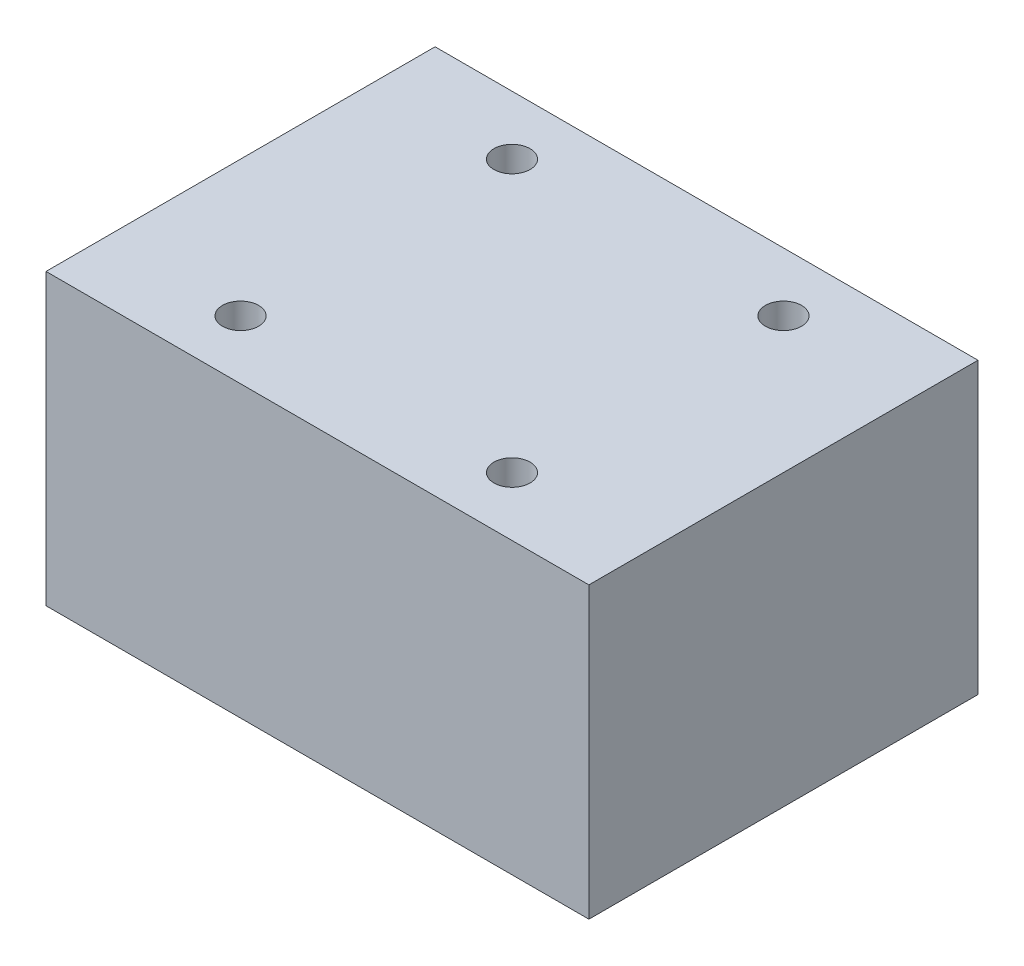
ISO-10303-21;
HEADER;
FILE_DESCRIPTION(('STEP AP214'),'2;1');
FILE_NAME('part.step','',(''),(''),'','','');
FILE_SCHEMA(('AUTOMOTIVE_DESIGN { 1 0 10303 214 1 1 1 1 }'));
ENDSEC;
DATA;
#1=APPLICATION_CONTEXT('core data for automotive mechanical design processes');
#2=APPLICATION_PROTOCOL_DEFINITION('international standard','automotive_design',2000,#1);
#3=PRODUCT_CONTEXT('',#1,'mechanical');
#4=PRODUCT('Part','Part','',(#3));
#5=PRODUCT_RELATED_PRODUCT_CATEGORY('part','',(#4));
#6=PRODUCT_DEFINITION_FORMATION('','',#4);
#7=PRODUCT_DEFINITION_CONTEXT('part definition',#1,'design');
#8=PRODUCT_DEFINITION('design','',#6,#7);
#9=PRODUCT_DEFINITION_SHAPE('','',#8);
#10=(LENGTH_UNIT() NAMED_UNIT(*) SI_UNIT(.MILLI.,.METRE.));
#11=(NAMED_UNIT(*) PLANE_ANGLE_UNIT() SI_UNIT($,.RADIAN.));
#12=(NAMED_UNIT(*) SI_UNIT($,.STERADIAN.) SOLID_ANGLE_UNIT());
#13=UNCERTAINTY_MEASURE_WITH_UNIT(LENGTH_MEASURE(1.E-05),#10,'distance_accuracy_value','');
#14=(GEOMETRIC_REPRESENTATION_CONTEXT(3) GLOBAL_UNCERTAINTY_ASSIGNED_CONTEXT((#13)) GLOBAL_UNIT_ASSIGNED_CONTEXT((#10,
#11,#12)) REPRESENTATION_CONTEXT('',''));
#15=CARTESIAN_POINT('',(0.,0.,0.));
#16=DIRECTION('',(0.,0.,1.));
#17=DIRECTION('',(1.,0.,0.));
#18=AXIS2_PLACEMENT_3D('',#15,#16,#17);
#19=CARTESIAN_POINT('',(30.,32.,-21.5));
#20=DIRECTION('',(-1.,0.,0.));
#21=DIRECTION('',(0.,0.,1.));
#22=AXIS2_PLACEMENT_3D('',#19,#20,#21);
#23=PLANE('',#22);
#24=DIRECTION('',(0.,0.,-1.));
#25=VECTOR('',#24,1.);
#26=CARTESIAN_POINT('',(30.,0.,-21.5));
#27=LINE('',#26,#25);
#28=CARTESIAN_POINT('',(30.,0.,21.5));
#29=VERTEX_POINT('',#28);
#30=CARTESIAN_POINT('',(30.,0.,-21.5));
#31=VERTEX_POINT('',#30);
#32=EDGE_CURVE('E107',#29,#31,#27,.T.);
#33=ORIENTED_EDGE('',*,*,#32,.T.);
#34=DIRECTION('',(0.,-1.,0.));
#35=VECTOR('',#34,1.);
#36=CARTESIAN_POINT('',(30.,32.,-21.5));
#37=LINE('',#36,#35);
#38=CARTESIAN_POINT('',(30.,32.,-21.5));
#39=VERTEX_POINT('',#38);
#40=EDGE_CURVE('E11',#39,#31,#37,.T.);
#41=ORIENTED_EDGE('',*,*,#40,.F.);
#42=DIRECTION('',(0.,0.,-1.));
#43=VECTOR('',#42,1.);
#44=CARTESIAN_POINT('',(30.,32.,-21.5));
#45=LINE('',#44,#43);
#46=CARTESIAN_POINT('',(30.,32.,21.5));
#47=VERTEX_POINT('',#46);
#48=EDGE_CURVE('E91',#47,#39,#45,.T.);
#49=ORIENTED_EDGE('',*,*,#48,.F.);
#50=DIRECTION('',(0.,-1.,0.));
#51=VECTOR('',#50,1.);
#52=CARTESIAN_POINT('',(30.,32.,21.5));
#53=LINE('',#52,#51);
#54=EDGE_CURVE('E103',#47,#29,#53,.T.);
#55=ORIENTED_EDGE('',*,*,#54,.T.);
#56=EDGE_LOOP('',(#33,#41,#49,#55));
#57=FACE_BOUND('',#56,.T.);
#58=ADVANCED_FACE('F39',(#57),#23,.F.);
#59=CARTESIAN_POINT('',(-30.,32.,-21.5));
#60=DIRECTION('',(0.,0.,1.));
#61=DIRECTION('',(1.,0.,0.));
#62=AXIS2_PLACEMENT_3D('',#59,#60,#61);
#63=PLANE('',#62);
#64=DIRECTION('',(-1.,0.,0.));
#65=VECTOR('',#64,1.);
#66=CARTESIAN_POINT('',(-30.,0.,-21.5));
#67=LINE('',#66,#65);
#68=CARTESIAN_POINT('',(-30.,0.,-21.5));
#69=VERTEX_POINT('',#68);
#70=EDGE_CURVE('E96',#31,#69,#67,.T.);
#71=ORIENTED_EDGE('',*,*,#70,.T.);
#72=DIRECTION('',(0.,-1.,0.));
#73=VECTOR('',#72,1.);
#74=CARTESIAN_POINT('',(-30.,32.,-21.5));
#75=LINE('',#74,#73);
#76=CARTESIAN_POINT('',(-30.,32.,-21.5));
#77=VERTEX_POINT('',#76);
#78=EDGE_CURVE('E48',#77,#69,#75,.T.);
#79=ORIENTED_EDGE('',*,*,#78,.F.);
#80=DIRECTION('',(-1.,0.,0.));
#81=VECTOR('',#80,1.);
#82=CARTESIAN_POINT('',(-30.,32.,-21.5));
#83=LINE('',#82,#81);
#84=EDGE_CURVE('E86',#39,#77,#83,.T.);
#85=ORIENTED_EDGE('',*,*,#84,.F.);
#86=ORIENTED_EDGE('',*,*,#40,.T.);
#87=EDGE_LOOP('',(#71,#79,#85,#86));
#88=FACE_BOUND('',#87,.T.);
#89=ADVANCED_FACE('F95',(#88),#63,.F.);
#90=CARTESIAN_POINT('',(-30.,32.,-21.5));
#91=DIRECTION('',(1.,0.,0.));
#92=DIRECTION('',(0.,0.,-1.));
#93=AXIS2_PLACEMENT_3D('',#90,#91,#92);
#94=PLANE('',#93);
#95=DIRECTION('',(0.,0.,1.));
#96=VECTOR('',#95,1.);
#97=CARTESIAN_POINT('',(-30.,0.,-21.5));
#98=LINE('',#97,#96);
#99=CARTESIAN_POINT('',(-30.,0.,21.5));
#100=VERTEX_POINT('',#99);
#101=EDGE_CURVE('E73',#69,#100,#98,.T.);
#102=ORIENTED_EDGE('',*,*,#101,.T.);
#103=DIRECTION('',(0.,-1.,0.));
#104=VECTOR('',#103,1.);
#105=CARTESIAN_POINT('',(-30.,32.,21.5));
#106=LINE('',#105,#104);
#107=CARTESIAN_POINT('',(-30.,32.,21.5));
#108=VERTEX_POINT('',#107);
#109=EDGE_CURVE('E98',#108,#100,#106,.T.);
#110=ORIENTED_EDGE('',*,*,#109,.F.);
#111=DIRECTION('',(0.,0.,1.));
#112=VECTOR('',#111,1.);
#113=CARTESIAN_POINT('',(-30.,32.,-21.5));
#114=LINE('',#113,#112);
#115=EDGE_CURVE('E89',#77,#108,#114,.T.);
#116=ORIENTED_EDGE('',*,*,#115,.F.);
#117=ORIENTED_EDGE('',*,*,#78,.T.);
#118=EDGE_LOOP('',(#102,#110,#116,#117));
#119=FACE_BOUND('',#118,.T.);
#120=ADVANCED_FACE('F99',(#119),#94,.F.);
#121=CARTESIAN_POINT('',(-30.,32.,21.5));
#122=DIRECTION('',(0.,0.,-1.));
#123=DIRECTION('',(-1.,0.,0.));
#124=AXIS2_PLACEMENT_3D('',#121,#122,#123);
#125=PLANE('',#124);
#126=DIRECTION('',(1.,0.,0.));
#127=VECTOR('',#126,1.);
#128=CARTESIAN_POINT('',(-30.,0.,21.5));
#129=LINE('',#128,#127);
#130=EDGE_CURVE('E79',#100,#29,#129,.T.);
#131=ORIENTED_EDGE('',*,*,#130,.T.);
#132=ORIENTED_EDGE('',*,*,#54,.F.);
#133=DIRECTION('',(1.,0.,0.));
#134=VECTOR('',#133,1.);
#135=CARTESIAN_POINT('',(-30.,32.,21.5));
#136=LINE('',#135,#134);
#137=EDGE_CURVE('E56',#108,#47,#136,.T.);
#138=ORIENTED_EDGE('',*,*,#137,.F.);
#139=ORIENTED_EDGE('',*,*,#109,.T.);
#140=EDGE_LOOP('',(#131,#132,#138,#139));
#141=FACE_BOUND('',#140,.T.);
#142=ADVANCED_FACE('F121',(#141),#125,.F.);
#143=CARTESIAN_POINT('',(0.,32.,0.));
#144=DIRECTION('',(0.,1.,0.));
#145=DIRECTION('',(0.,0.,1.));
#146=AXIS2_PLACEMENT_3D('',#143,#144,#145);
#147=PLANE('',#146);
#148=CARTESIAN_POINT('',(-15.,32.,-15.));
#149=DIRECTION('',(0.,1.,0.));
#150=DIRECTION('',(0.,0.,1.));
#151=AXIS2_PLACEMENT_3D('',#148,#149,#150);
#152=CIRCLE('',#151,2.);
#153=CARTESIAN_POINT('',(-15.,32.,-13.));
#154=VERTEX_POINT('',#153);
#155=EDGE_CURVE('E155',#154,#154,#152,.T.);
#156=ORIENTED_EDGE('',*,*,#155,.F.);
#157=EDGE_LOOP('',(#156));
#158=FACE_BOUND('',#157,.T.);
#159=CARTESIAN_POINT('',(-15.,32.,15.));
#160=DIRECTION('',(0.,1.,0.));
#161=DIRECTION('',(0.,0.,1.));
#162=AXIS2_PLACEMENT_3D('',#159,#160,#161);
#163=CIRCLE('',#162,2.);
#164=CARTESIAN_POINT('',(-15.,32.,17.));
#165=VERTEX_POINT('',#164);
#166=EDGE_CURVE('E147',#165,#165,#163,.T.);
#167=ORIENTED_EDGE('',*,*,#166,.F.);
#168=EDGE_LOOP('',(#167));
#169=FACE_BOUND('',#168,.T.);
#170=CARTESIAN_POINT('',(15.,32.,15.));
#171=DIRECTION('',(0.,1.,0.));
#172=DIRECTION('',(0.,0.,1.));
#173=AXIS2_PLACEMENT_3D('',#170,#171,#172);
#174=CIRCLE('',#173,2.);
#175=CARTESIAN_POINT('',(15.,32.,17.));
#176=VERTEX_POINT('',#175);
#177=EDGE_CURVE('E139',#176,#176,#174,.T.);
#178=ORIENTED_EDGE('',*,*,#177,.F.);
#179=EDGE_LOOP('',(#178));
#180=FACE_BOUND('',#179,.T.);
#181=CARTESIAN_POINT('',(15.,32.,-15.));
#182=DIRECTION('',(0.,1.,0.));
#183=DIRECTION('',(0.,0.,1.));
#184=AXIS2_PLACEMENT_3D('',#181,#182,#183);
#185=CIRCLE('',#184,2.);
#186=CARTESIAN_POINT('',(15.,32.,-13.));
#187=VERTEX_POINT('',#186);
#188=EDGE_CURVE('E131',#187,#187,#185,.T.);
#189=ORIENTED_EDGE('',*,*,#188,.F.);
#190=EDGE_LOOP('',(#189));
#191=FACE_BOUND('',#190,.T.);
#192=ORIENTED_EDGE('',*,*,#48,.T.);
#193=ORIENTED_EDGE('',*,*,#84,.T.);
#194=ORIENTED_EDGE('',*,*,#115,.T.);
#195=ORIENTED_EDGE('',*,*,#137,.T.);
#196=EDGE_LOOP('',(#192,#193,#194,#195));
#197=FACE_BOUND('',#196,.T.);
#198=ADVANCED_FACE('F87',(#158,#169,#180,#191,#197),#147,.T.);
#199=CARTESIAN_POINT('',(0.,0.,0.));
#200=DIRECTION('',(0.,1.,0.));
#201=DIRECTION('',(0.,0.,1.));
#202=AXIS2_PLACEMENT_3D('',#199,#200,#201);
#203=PLANE('',#202);
#204=CARTESIAN_POINT('',(-15.,0.,-15.));
#205=DIRECTION('',(0.,1.,0.));
#206=DIRECTION('',(0.,0.,1.));
#207=AXIS2_PLACEMENT_3D('',#204,#205,#206);
#208=CIRCLE('',#207,1.99999999999999);
#209=CARTESIAN_POINT('',(-15.,0.,-13.));
#210=VERTEX_POINT('',#209);
#211=EDGE_CURVE('E151',#210,#210,#208,.T.);
#212=ORIENTED_EDGE('',*,*,#211,.T.);
#213=EDGE_LOOP('',(#212));
#214=FACE_BOUND('',#213,.T.);
#215=CARTESIAN_POINT('',(-15.,0.,15.));
#216=DIRECTION('',(0.,1.,0.));
#217=DIRECTION('',(0.,0.,1.));
#218=AXIS2_PLACEMENT_3D('',#215,#216,#217);
#219=CIRCLE('',#218,1.99999999999999);
#220=CARTESIAN_POINT('',(-15.,0.,17.));
#221=VERTEX_POINT('',#220);
#222=EDGE_CURVE('E143',#221,#221,#219,.T.);
#223=ORIENTED_EDGE('',*,*,#222,.T.);
#224=EDGE_LOOP('',(#223));
#225=FACE_BOUND('',#224,.T.);
#226=CARTESIAN_POINT('',(15.,0.,15.));
#227=DIRECTION('',(0.,1.,0.));
#228=DIRECTION('',(0.,0.,1.));
#229=AXIS2_PLACEMENT_3D('',#226,#227,#228);
#230=CIRCLE('',#229,1.99999999999999);
#231=CARTESIAN_POINT('',(15.,0.,17.));
#232=VERTEX_POINT('',#231);
#233=EDGE_CURVE('E135',#232,#232,#230,.T.);
#234=ORIENTED_EDGE('',*,*,#233,.T.);
#235=EDGE_LOOP('',(#234));
#236=FACE_BOUND('',#235,.T.);
#237=CARTESIAN_POINT('',(15.,0.,-15.));
#238=DIRECTION('',(0.,1.,0.));
#239=DIRECTION('',(0.,0.,1.));
#240=AXIS2_PLACEMENT_3D('',#237,#238,#239);
#241=CIRCLE('',#240,1.99999999999999);
#242=CARTESIAN_POINT('',(15.,0.,-13.));
#243=VERTEX_POINT('',#242);
#244=EDGE_CURVE('E111',#243,#243,#241,.T.);
#245=ORIENTED_EDGE('',*,*,#244,.T.);
#246=EDGE_LOOP('',(#245));
#247=FACE_BOUND('',#246,.T.);
#248=ORIENTED_EDGE('',*,*,#32,.F.);
#249=ORIENTED_EDGE('',*,*,#130,.F.);
#250=ORIENTED_EDGE('',*,*,#101,.F.);
#251=ORIENTED_EDGE('',*,*,#70,.F.);
#252=EDGE_LOOP('',(#248,#249,#250,#251));
#253=FACE_BOUND('',#252,.T.);
#254=ADVANCED_FACE('F124',(#214,#225,#236,#247,#253),#203,.F.);
#255=CARTESIAN_POINT('',(15.,32.,-15.));
#256=DIRECTION('',(0.,1.,0.));
#257=DIRECTION('',(0.,0.,1.));
#258=AXIS2_PLACEMENT_3D('',#255,#256,#257);
#259=CYLINDRICAL_SURFACE('',#258,1.99999999999999);
#260=ORIENTED_EDGE('',*,*,#244,.F.);
#261=EDGE_LOOP('',(#260));
#262=FACE_BOUND('',#261,.T.);
#263=ORIENTED_EDGE('',*,*,#188,.T.);
#264=EDGE_LOOP('',(#263));
#265=FACE_BOUND('',#264,.T.);
#266=ADVANCED_FACE('F171',(#262,#265),#259,.F.);
#267=CARTESIAN_POINT('',(15.,32.,15.));
#268=DIRECTION('',(0.,1.,0.));
#269=DIRECTION('',(0.,0.,1.));
#270=AXIS2_PLACEMENT_3D('',#267,#268,#269);
#271=CYLINDRICAL_SURFACE('',#270,1.99999999999999);
#272=ORIENTED_EDGE('',*,*,#233,.F.);
#273=EDGE_LOOP('',(#272));
#274=FACE_BOUND('',#273,.T.);
#275=ORIENTED_EDGE('',*,*,#177,.T.);
#276=EDGE_LOOP('',(#275));
#277=FACE_BOUND('',#276,.T.);
#278=ADVANCED_FACE('F173',(#274,#277),#271,.F.);
#279=CARTESIAN_POINT('',(-15.,32.,15.));
#280=DIRECTION('',(0.,1.,0.));
#281=DIRECTION('',(0.,0.,1.));
#282=AXIS2_PLACEMENT_3D('',#279,#280,#281);
#283=CYLINDRICAL_SURFACE('',#282,1.99999999999999);
#284=ORIENTED_EDGE('',*,*,#222,.F.);
#285=EDGE_LOOP('',(#284));
#286=FACE_BOUND('',#285,.T.);
#287=ORIENTED_EDGE('',*,*,#166,.T.);
#288=EDGE_LOOP('',(#287));
#289=FACE_BOUND('',#288,.T.);
#290=ADVANCED_FACE('F180',(#286,#289),#283,.F.);
#291=CARTESIAN_POINT('',(-15.,32.,-15.));
#292=DIRECTION('',(0.,1.,0.));
#293=DIRECTION('',(0.,0.,1.));
#294=AXIS2_PLACEMENT_3D('',#291,#292,#293);
#295=CYLINDRICAL_SURFACE('',#294,1.99999999999999);
#296=ORIENTED_EDGE('',*,*,#211,.F.);
#297=EDGE_LOOP('',(#296));
#298=FACE_BOUND('',#297,.T.);
#299=ORIENTED_EDGE('',*,*,#155,.T.);
#300=EDGE_LOOP('',(#299));
#301=FACE_BOUND('',#300,.T.);
#302=ADVANCED_FACE('F160',(#298,#301),#295,.F.);
#303=CLOSED_SHELL('',(#58,#89,#120,#142,#198,#254,#266,#278,#290,#302));
#304=MANIFOLD_SOLID_BREP('B2',#303);
#305=ADVANCED_BREP_SHAPE_REPRESENTATION('',(#18,#304),#14);
#306=SHAPE_DEFINITION_REPRESENTATION(#9,#305);
ENDSEC;
END-ISO-10303-21;
